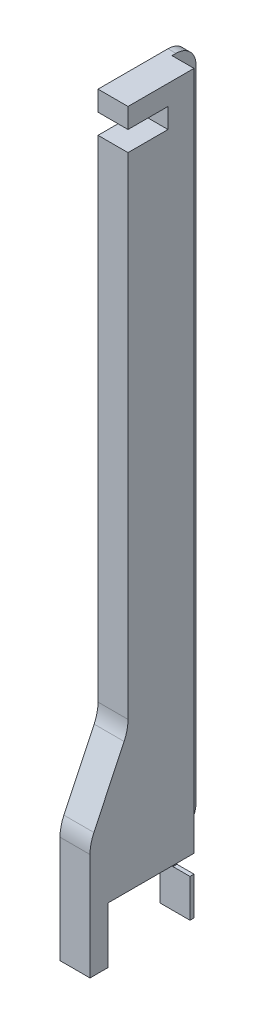
ISO-10303-21;
HEADER;
FILE_DESCRIPTION(('STEP AP214'),'2;1');
FILE_NAME('part.step','',(''),(''),'','','');
FILE_SCHEMA(('AUTOMOTIVE_DESIGN { 1 0 10303 214 1 1 1 1 }'));
ENDSEC;
DATA;
#1=APPLICATION_CONTEXT('core data for automotive mechanical design processes');
#2=APPLICATION_PROTOCOL_DEFINITION('international standard','automotive_design',2000,#1);
#3=PRODUCT_CONTEXT('',#1,'mechanical');
#4=PRODUCT('Part','Part','',(#3));
#5=PRODUCT_RELATED_PRODUCT_CATEGORY('part','',(#4));
#6=PRODUCT_DEFINITION_FORMATION('','',#4);
#7=PRODUCT_DEFINITION_CONTEXT('part definition',#1,'design');
#8=PRODUCT_DEFINITION('design','',#6,#7);
#9=PRODUCT_DEFINITION_SHAPE('','',#8);
#10=(LENGTH_UNIT() NAMED_UNIT(*) SI_UNIT(.MILLI.,.METRE.));
#11=(NAMED_UNIT(*) PLANE_ANGLE_UNIT() SI_UNIT($,.RADIAN.));
#12=(NAMED_UNIT(*) SI_UNIT($,.STERADIAN.) SOLID_ANGLE_UNIT());
#13=UNCERTAINTY_MEASURE_WITH_UNIT(LENGTH_MEASURE(1.E-05),#10,'distance_accuracy_value','');
#14=(GEOMETRIC_REPRESENTATION_CONTEXT(3) GLOBAL_UNCERTAINTY_ASSIGNED_CONTEXT((#13)) GLOBAL_UNIT_ASSIGNED_CONTEXT((#10,
#11,#12)) REPRESENTATION_CONTEXT('',''));
#15=CARTESIAN_POINT('',(0.,0.,0.));
#16=DIRECTION('',(0.,0.,1.));
#17=DIRECTION('',(1.,0.,0.));
#18=AXIS2_PLACEMENT_3D('',#15,#16,#17);
#19=CARTESIAN_POINT('',(183.,0.,26.));
#20=DIRECTION('',(1.,0.,0.));
#21=DIRECTION('',(0.,1.,0.));
#22=AXIS2_PLACEMENT_3D('',#19,#20,#21);
#23=PLANE('',#22);
#24=DIRECTION('',(0.,0.,-1.));
#25=VECTOR('',#24,1.);
#26=CARTESIAN_POINT('',(183.,-340.,26.));
#27=LINE('',#26,#25);
#28=CARTESIAN_POINT('',(183.,-340.,36.));
#29=VERTEX_POINT('',#28);
#30=CARTESIAN_POINT('',(183.,-340.,-7.));
#31=VERTEX_POINT('',#30);
#32=EDGE_CURVE('E333',#29,#31,#27,.T.);
#33=ORIENTED_EDGE('',*,*,#32,.T.);
#34=DIRECTION('',(0.,-1.,0.));
#35=VECTOR('',#34,1.);
#36=CARTESIAN_POINT('',(183.,0.,-7.));
#37=LINE('',#36,#35);
#38=CARTESIAN_POINT('',(183.,0.,-7.));
#39=VERTEX_POINT('',#38);
#40=EDGE_CURVE('E300',#39,#31,#37,.T.);
#41=ORIENTED_EDGE('',*,*,#40,.F.);
#42=DIRECTION('',(0.,0.,-1.));
#43=VECTOR('',#42,1.);
#44=CARTESIAN_POINT('',(183.,0.,26.));
#45=LINE('',#44,#43);
#46=CARTESIAN_POINT('',(183.,0.,26.));
#47=VERTEX_POINT('',#46);
#48=EDGE_CURVE('E329',#47,#39,#45,.T.);
#49=ORIENTED_EDGE('',*,*,#48,.F.);
#50=DIRECTION('',(0.,-1.,0.));
#51=VECTOR('',#50,1.);
#52=CARTESIAN_POINT('',(183.,0.,26.));
#53=LINE('',#52,#51);
#54=CARTESIAN_POINT('',(183.,-9.99999999999994,26.));
#55=VERTEX_POINT('',#54);
#56=EDGE_CURVE('E322',#47,#55,#53,.T.);
#57=ORIENTED_EDGE('',*,*,#56,.T.);
#58=DIRECTION('',(0.,0.,-1.));
#59=VECTOR('',#58,1.);
#60=CARTESIAN_POINT('',(183.,-9.99999999999993,0.));
#61=LINE('',#60,#59);
#62=CARTESIAN_POINT('',(183.,-9.99999999999994,6.00000000000002));
#63=VERTEX_POINT('',#62);
#64=EDGE_CURVE('E222',#55,#63,#61,.T.);
#65=ORIENTED_EDGE('',*,*,#64,.T.);
#66=DIRECTION('',(0.,-1.,0.));
#67=VECTOR('',#66,1.);
#68=CARTESIAN_POINT('',(183.,0.,6.00000000000002));
#69=LINE('',#68,#67);
#70=CARTESIAN_POINT('',(183.,-19.9999999999999,6.00000000000002));
#71=VERTEX_POINT('',#70);
#72=EDGE_CURVE('E230',#63,#71,#69,.T.);
#73=ORIENTED_EDGE('',*,*,#72,.T.);
#74=DIRECTION('',(0.,0.,1.));
#75=VECTOR('',#74,1.);
#76=CARTESIAN_POINT('',(183.,-19.9999999999999,0.));
#77=LINE('',#76,#75);
#78=CARTESIAN_POINT('',(183.,-20.,26.));
#79=VERTEX_POINT('',#78);
#80=EDGE_CURVE('E228',#71,#79,#77,.T.);
#81=ORIENTED_EDGE('',*,*,#80,.T.);
#82=CARTESIAN_POINT('',(183.,-265.491389841085,26.));
#83=VERTEX_POINT('',#82);
#84=EDGE_CURVE('E321',#79,#83,#53,.T.);
#85=ORIENTED_EDGE('',*,*,#84,.T.);
#86=CARTESIAN_POINT('',(183.,-265.491389841085,46.));
#87=DIRECTION('',(1.,0.,0.));
#88=DIRECTION('',(0.,1.,0.));
#89=AXIS2_PLACEMENT_3D('',#86,#87,#88);
#90=CIRCLE('',#89,20.);
#91=CARTESIAN_POINT('',(183.,-274.072526132451,27.9344499129142));
#92=VERTEX_POINT('',#91);
#93=EDGE_CURVE('E366',#83,#92,#90,.F.);
#94=ORIENTED_EDGE('',*,*,#93,.T.);
#95=DIRECTION('',(0.,0.90327750435429,-0.429056814568288));
#96=VECTOR('',#95,1.);
#97=CARTESIAN_POINT('',(183.,-39.6277409484958,-83.4268230494646));
#98=LINE('',#97,#96);
#99=CARTESIAN_POINT('',(183.,-305.927473867549,43.0655500870858));
#100=VERTEX_POINT('',#99);
#101=EDGE_CURVE('E247',#100,#92,#98,.T.);
#102=ORIENTED_EDGE('',*,*,#101,.F.);
#103=CARTESIAN_POINT('',(183.,-314.508610158915,25.));
#104=DIRECTION('',(1.,0.,0.));
#105=DIRECTION('',(0.,1.,0.));
#106=AXIS2_PLACEMENT_3D('',#103,#104,#105);
#107=CIRCLE('',#106,20.);
#108=CARTESIAN_POINT('',(183.,-314.508610158915,45.));
#109=VERTEX_POINT('',#108);
#110=EDGE_CURVE('E360',#100,#109,#107,.T.);
#111=ORIENTED_EDGE('',*,*,#110,.T.);
#112=DIRECTION('',(0.,-1.,0.));
#113=VECTOR('',#112,1.);
#114=CARTESIAN_POINT('',(183.,-310.,45.));
#115=LINE('',#114,#113);
#116=CARTESIAN_POINT('',(183.,-368.,45.));
#117=VERTEX_POINT('',#116);
#118=EDGE_CURVE('E271',#109,#117,#115,.T.);
#119=ORIENTED_EDGE('',*,*,#118,.T.);
#120=DIRECTION('',(0.,0.,-1.));
#121=VECTOR('',#120,1.);
#122=CARTESIAN_POINT('',(183.,-368.,0.));
#123=LINE('',#122,#121);
#124=CARTESIAN_POINT('',(183.,-368.,36.));
#125=VERTEX_POINT('',#124);
#126=EDGE_CURVE('E262',#117,#125,#123,.T.);
#127=ORIENTED_EDGE('',*,*,#126,.T.);
#128=DIRECTION('',(0.,1.,0.));
#129=VECTOR('',#128,1.);
#130=CARTESIAN_POINT('',(183.,-368.,36.));
#131=LINE('',#130,#129);
#132=EDGE_CURVE('E265',#125,#29,#131,.T.);
#133=ORIENTED_EDGE('',*,*,#132,.T.);
#134=EDGE_LOOP('',(#33,#41,#49,#57,#65,#73,#81,#85,#94,#102,#111,#119,#127,#133));
#135=FACE_BOUND('',#134,.T.);
#136=ADVANCED_FACE('F34',(#135),#23,.T.);
#137=CARTESIAN_POINT('',(0.,0.,26.));
#138=DIRECTION('',(0.,0.,1.));
#139=DIRECTION('',(1.,0.,0.));
#140=AXIS2_PLACEMENT_3D('',#137,#138,#139);
#141=PLANE('',#140);
#142=DIRECTION('',(0.,-1.,0.));
#143=VECTOR('',#142,1.);
#144=CARTESIAN_POINT('',(168.,-19.9999999999999,26.));
#145=LINE('',#144,#143);
#146=CARTESIAN_POINT('',(168.,0.,26.));
#147=VERTEX_POINT('',#146);
#148=CARTESIAN_POINT('',(168.,-9.99999999999994,26.));
#149=VERTEX_POINT('',#148);
#150=EDGE_CURVE('E326',#147,#149,#145,.T.);
#151=ORIENTED_EDGE('',*,*,#150,.T.);
#152=DIRECTION('',(1.,0.,0.));
#153=VECTOR('',#152,1.);
#154=CARTESIAN_POINT('',(-434.,-10.,26.));
#155=LINE('',#154,#153);
#156=EDGE_CURVE('E233',#149,#55,#155,.T.);
#157=ORIENTED_EDGE('',*,*,#156,.T.);
#158=ORIENTED_EDGE('',*,*,#56,.F.);
#159=DIRECTION('',(-1.,0.,0.));
#160=VECTOR('',#159,1.);
#161=CARTESIAN_POINT('',(-168.,0.,26.));
#162=LINE('',#161,#160);
#163=EDGE_CURVE('E317',#47,#147,#162,.T.);
#164=ORIENTED_EDGE('',*,*,#163,.T.);
#165=EDGE_LOOP('',(#151,#157,#158,#164));
#166=FACE_BOUND('',#165,.T.);
#167=ADVANCED_FACE('F464',(#166),#141,.T.);
#168=ORIENTED_EDGE('',*,*,#84,.F.);
#169=DIRECTION('',(1.,0.,0.));
#170=VECTOR('',#169,1.);
#171=CARTESIAN_POINT('',(-434.,-20.,26.));
#172=LINE('',#171,#170);
#173=CARTESIAN_POINT('',(168.,-19.9999999999999,26.));
#174=VERTEX_POINT('',#173);
#175=EDGE_CURVE('E49',#174,#79,#172,.T.);
#176=ORIENTED_EDGE('',*,*,#175,.F.);
#177=CARTESIAN_POINT('',(168.,-265.491389841085,26.));
#178=VERTEX_POINT('',#177);
#179=EDGE_CURVE('E325',#174,#178,#145,.T.);
#180=ORIENTED_EDGE('',*,*,#179,.T.);
#181=DIRECTION('',(1.,0.,0.));
#182=VECTOR('',#181,1.);
#183=CARTESIAN_POINT('',(0.,-265.491389841085,26.));
#184=LINE('',#183,#182);
#185=EDGE_CURVE('E352',#178,#83,#184,.T.);
#186=ORIENTED_EDGE('',*,*,#185,.T.);
#187=EDGE_LOOP('',(#168,#176,#180,#186));
#188=FACE_BOUND('',#187,.T.);
#189=ADVANCED_FACE('F451',(#188),#141,.T.);
#190=CARTESIAN_POINT('',(168.,-19.9999999999999,26.));
#191=DIRECTION('',(1.,0.,0.));
#192=DIRECTION('',(0.,1.,0.));
#193=AXIS2_PLACEMENT_3D('',#190,#191,#192);
#194=PLANE('',#193);
#195=DIRECTION('',(0.,0.,-1.));
#196=VECTOR('',#195,1.);
#197=CARTESIAN_POINT('',(168.,-9.99999999999994,26.));
#198=LINE('',#197,#196);
#199=CARTESIAN_POINT('',(168.,-9.99999999999994,6.00000000000002));
#200=VERTEX_POINT('',#199);
#201=EDGE_CURVE('E245',#149,#200,#198,.T.);
#202=ORIENTED_EDGE('',*,*,#201,.F.);
#203=ORIENTED_EDGE('',*,*,#150,.F.);
#204=DIRECTION('',(0.,0.,1.));
#205=VECTOR('',#204,1.);
#206=CARTESIAN_POINT('',(168.,0.,-19.));
#207=LINE('',#206,#205);
#208=CARTESIAN_POINT('',(168.,0.,-9.));
#209=VERTEX_POINT('',#208);
#210=EDGE_CURVE('E314',#209,#147,#207,.T.);
#211=ORIENTED_EDGE('',*,*,#210,.F.);
#212=CARTESIAN_POINT('',(168.,-9.99999999999996,-9.));
#213=DIRECTION('',(1.,0.,0.));
#214=DIRECTION('',(0.,1.,0.));
#215=AXIS2_PLACEMENT_3D('',#212,#213,#214);
#216=CIRCLE('',#215,10.);
#217=CARTESIAN_POINT('',(168.,-9.99999999999996,-19.));
#218=VERTEX_POINT('',#217);
#219=EDGE_CURVE('E350',#209,#218,#216,.F.);
#220=ORIENTED_EDGE('',*,*,#219,.T.);
#221=DIRECTION('',(0.,1.,0.));
#222=VECTOR('',#221,1.);
#223=CARTESIAN_POINT('',(168.,0.,-19.));
#224=LINE('',#223,#222);
#225=CARTESIAN_POINT('',(168.,-330.,-19.));
#226=VERTEX_POINT('',#225);
#227=EDGE_CURVE('E307',#226,#218,#224,.T.);
#228=ORIENTED_EDGE('',*,*,#227,.F.);
#229=CARTESIAN_POINT('',(168.,-330.,-9.));
#230=DIRECTION('',(1.,0.,0.));
#231=DIRECTION('',(0.,1.,0.));
#232=AXIS2_PLACEMENT_3D('',#229,#230,#231);
#233=CIRCLE('',#232,10.);
#234=CARTESIAN_POINT('',(168.,-338.,-15.));
#235=VERTEX_POINT('',#234);
#236=EDGE_CURVE('E347',#226,#235,#233,.F.);
#237=ORIENTED_EDGE('',*,*,#236,.T.);
#238=CARTESIAN_POINT('',(168.,-354.,-27.));
#239=DIRECTION('',(1.,0.,0.));
#240=DIRECTION('',(0.,1.,0.));
#241=AXIS2_PLACEMENT_3D('',#238,#239,#240);
#242=CIRCLE('',#241,20.);
#243=CARTESIAN_POINT('',(168.,-354.,-7.));
#244=VERTEX_POINT('',#243);
#245=EDGE_CURVE('E42',#235,#244,#242,.T.);
#246=ORIENTED_EDGE('',*,*,#245,.T.);
#247=DIRECTION('',(0.,1.,0.));
#248=VECTOR('',#247,1.);
#249=CARTESIAN_POINT('',(168.,-368.,-7.));
#250=LINE('',#249,#248);
#251=CARTESIAN_POINT('',(168.,-368.,-7.));
#252=VERTEX_POINT('',#251);
#253=EDGE_CURVE('E291',#252,#244,#250,.T.);
#254=ORIENTED_EDGE('',*,*,#253,.F.);
#255=DIRECTION('',(0.,0.,1.));
#256=VECTOR('',#255,1.);
#257=CARTESIAN_POINT('',(168.,-368.,0.));
#258=LINE('',#257,#256);
#259=CARTESIAN_POINT('',(168.,-368.,-5.));
#260=VERTEX_POINT('',#259);
#261=EDGE_CURVE('E288',#252,#260,#258,.T.);
#262=ORIENTED_EDGE('',*,*,#261,.T.);
#263=DIRECTION('',(0.,1.,0.));
#264=VECTOR('',#263,1.);
#265=CARTESIAN_POINT('',(168.,-368.,-5.));
#266=LINE('',#265,#264);
#267=CARTESIAN_POINT('',(168.,-340.,-5.));
#268=VERTEX_POINT('',#267);
#269=EDGE_CURVE('E295',#260,#268,#266,.T.);
#270=ORIENTED_EDGE('',*,*,#269,.T.);
#271=DIRECTION('',(0.,0.,-1.));
#272=VECTOR('',#271,1.);
#273=CARTESIAN_POINT('',(168.,-340.,26.));
#274=LINE('',#273,#272);
#275=CARTESIAN_POINT('',(168.,-340.,36.));
#276=VERTEX_POINT('',#275);
#277=EDGE_CURVE('E330',#276,#268,#274,.T.);
#278=ORIENTED_EDGE('',*,*,#277,.F.);
#279=DIRECTION('',(0.,1.,0.));
#280=VECTOR('',#279,1.);
#281=CARTESIAN_POINT('',(168.,-368.,36.));
#282=LINE('',#281,#280);
#283=CARTESIAN_POINT('',(168.,-368.,36.));
#284=VERTEX_POINT('',#283);
#285=EDGE_CURVE('E269',#284,#276,#282,.T.);
#286=ORIENTED_EDGE('',*,*,#285,.F.);
#287=DIRECTION('',(0.,0.,1.));
#288=VECTOR('',#287,1.);
#289=CARTESIAN_POINT('',(168.,-368.,0.));
#290=LINE('',#289,#288);
#291=CARTESIAN_POINT('',(168.,-368.,45.));
#292=VERTEX_POINT('',#291);
#293=EDGE_CURVE('E257',#284,#292,#290,.T.);
#294=ORIENTED_EDGE('',*,*,#293,.T.);
#295=DIRECTION('',(0.,-1.,0.));
#296=VECTOR('',#295,1.);
#297=CARTESIAN_POINT('',(168.,-310.,45.));
#298=LINE('',#297,#296);
#299=CARTESIAN_POINT('',(168.,-314.508610158915,45.));
#300=VERTEX_POINT('',#299);
#301=EDGE_CURVE('E272',#300,#292,#298,.T.);
#302=ORIENTED_EDGE('',*,*,#301,.F.);
#303=CARTESIAN_POINT('',(168.,-314.508610158915,25.));
#304=DIRECTION('',(1.,0.,0.));
#305=DIRECTION('',(0.,1.,0.));
#306=AXIS2_PLACEMENT_3D('',#303,#304,#305);
#307=CIRCLE('',#306,20.);
#308=CARTESIAN_POINT('',(168.,-305.927473867549,43.0655500870858));
#309=VERTEX_POINT('',#308);
#310=EDGE_CURVE('E364',#300,#309,#307,.F.);
#311=ORIENTED_EDGE('',*,*,#310,.T.);
#312=DIRECTION('',(0.,0.90327750435429,-0.429056814568288));
#313=VECTOR('',#312,1.);
#314=CARTESIAN_POINT('',(168.,-39.6277409484958,-83.4268230494646));
#315=LINE('',#314,#313);
#316=CARTESIAN_POINT('',(168.,-274.072526132451,27.9344499129142));
#317=VERTEX_POINT('',#316);
#318=EDGE_CURVE('E248',#309,#317,#315,.T.);
#319=ORIENTED_EDGE('',*,*,#318,.T.);
#320=CARTESIAN_POINT('',(168.,-265.491389841085,46.));
#321=DIRECTION('',(1.,0.,0.));
#322=DIRECTION('',(0.,1.,0.));
#323=AXIS2_PLACEMENT_3D('',#320,#321,#322);
#324=CIRCLE('',#323,20.);
#325=EDGE_CURVE('E368',#317,#178,#324,.T.);
#326=ORIENTED_EDGE('',*,*,#325,.T.);
#327=ORIENTED_EDGE('',*,*,#179,.F.);
#328=DIRECTION('',(0.,0.,1.));
#329=VECTOR('',#328,1.);
#330=CARTESIAN_POINT('',(168.,-19.9999999999999,26.));
#331=LINE('',#330,#329);
#332=CARTESIAN_POINT('',(168.,-19.9999999999999,6.00000000000002));
#333=VERTEX_POINT('',#332);
#334=EDGE_CURVE('E236',#333,#174,#331,.T.);
#335=ORIENTED_EDGE('',*,*,#334,.F.);
#336=DIRECTION('',(0.,-1.,0.));
#337=VECTOR('',#336,1.);
#338=CARTESIAN_POINT('',(168.,-19.9999999999999,6.00000000000002));
#339=LINE('',#338,#337);
#340=EDGE_CURVE('E243',#200,#333,#339,.T.);
#341=ORIENTED_EDGE('',*,*,#340,.F.);
#342=EDGE_LOOP('',(#202,#203,#211,#220,#228,#237,#246,#254,#262,#270,#278,#286,#294,#302,#311,
#319,#326,#327,#335,#341));
#343=FACE_BOUND('',#342,.T.);
#344=ADVANCED_FACE('F377',(#343),#194,.F.);
#345=DIRECTION('',(0.,0.,-1.));
#346=VECTOR('',#345,1.);
#347=CARTESIAN_POINT('',(183.,-349.,-7.));
#348=LINE('',#347,#346);
#349=CARTESIAN_POINT('',(183.,-349.,-5.));
#350=VERTEX_POINT('',#349);
#351=CARTESIAN_POINT('',(183.,-349.,-7.));
#352=VERTEX_POINT('',#351);
#353=EDGE_CURVE('E215',#350,#352,#348,.T.);
#354=ORIENTED_EDGE('',*,*,#353,.F.);
#355=DIRECTION('',(0.,1.,0.));
#356=VECTOR('',#355,1.);
#357=CARTESIAN_POINT('',(183.,-368.,-5.));
#358=LINE('',#357,#356);
#359=CARTESIAN_POINT('',(183.,-368.,-5.));
#360=VERTEX_POINT('',#359);
#361=EDGE_CURVE('E220',#360,#350,#358,.T.);
#362=ORIENTED_EDGE('',*,*,#361,.F.);
#363=DIRECTION('',(0.,0.,-1.));
#364=VECTOR('',#363,1.);
#365=CARTESIAN_POINT('',(183.,-368.,0.));
#366=LINE('',#365,#364);
#367=CARTESIAN_POINT('',(183.,-368.,-7.));
#368=VERTEX_POINT('',#367);
#369=EDGE_CURVE('E283',#360,#368,#366,.T.);
#370=ORIENTED_EDGE('',*,*,#369,.T.);
#371=EDGE_CURVE('E299',#352,#368,#37,.T.);
#372=ORIENTED_EDGE('',*,*,#371,.F.);
#373=EDGE_LOOP('',(#354,#362,#370,#372));
#374=FACE_BOUND('',#373,.T.);
#375=ADVANCED_FACE('F417',(#374),#23,.T.);
#376=CARTESIAN_POINT('',(168.,0.,26.));
#377=DIRECTION('',(0.,1.,0.));
#378=DIRECTION('',(-1.,0.,0.));
#379=AXIS2_PLACEMENT_3D('',#376,#377,#378);
#380=PLANE('',#379);
#381=ORIENTED_EDGE('',*,*,#210,.T.);
#382=ORIENTED_EDGE('',*,*,#163,.F.);
#383=ORIENTED_EDGE('',*,*,#48,.T.);
#384=DIRECTION('',(1.,0.,0.));
#385=VECTOR('',#384,1.);
#386=CARTESIAN_POINT('',(0.,0.,-7.));
#387=LINE('',#386,#385);
#388=CARTESIAN_POINT('',(172.,0.,-7.));
#389=VERTEX_POINT('',#388);
#390=EDGE_CURVE('E303',#389,#39,#387,.T.);
#391=ORIENTED_EDGE('',*,*,#390,.F.);
#392=DIRECTION('',(0.,0.,1.));
#393=VECTOR('',#392,1.);
#394=CARTESIAN_POINT('',(172.,0.,-19.));
#395=LINE('',#394,#393);
#396=CARTESIAN_POINT('',(172.,0.,-9.));
#397=VERTEX_POINT('',#396);
#398=EDGE_CURVE('E313',#397,#389,#395,.T.);
#399=ORIENTED_EDGE('',*,*,#398,.F.);
#400=DIRECTION('',(1.,0.,0.));
#401=VECTOR('',#400,1.);
#402=CARTESIAN_POINT('',(168.,0.,-9.));
#403=LINE('',#402,#401);
#404=EDGE_CURVE('E332',#397,#209,#403,.F.);
#405=ORIENTED_EDGE('',*,*,#404,.T.);
#406=EDGE_LOOP('',(#381,#382,#383,#391,#399,#405));
#407=FACE_BOUND('',#406,.T.);
#408=ADVANCED_FACE('F404',(#407),#380,.T.);
#409=CARTESIAN_POINT('',(183.,-340.,26.));
#410=DIRECTION('',(0.,-1.,0.));
#411=DIRECTION('',(0.,0.,-1.));
#412=AXIS2_PLACEMENT_3D('',#409,#410,#411);
#413=PLANE('',#412);
#414=DIRECTION('',(1.,0.,0.));
#415=VECTOR('',#414,1.);
#416=CARTESIAN_POINT('',(0.,-340.,-4.99999999999992));
#417=LINE('',#416,#415);
#418=CARTESIAN_POINT('',(174.5,-340.,-5.));
#419=VERTEX_POINT('',#418);
#420=EDGE_CURVE('E205',#268,#419,#417,.T.);
#421=ORIENTED_EDGE('',*,*,#420,.T.);
#422=DIRECTION('',(0.,0.,-1.));
#423=VECTOR('',#422,1.);
#424=CARTESIAN_POINT('',(174.5,-340.,0.));
#425=LINE('',#424,#423);
#426=CARTESIAN_POINT('',(174.5,-340.,-7.));
#427=VERTEX_POINT('',#426);
#428=EDGE_CURVE('E200',#419,#427,#425,.T.);
#429=ORIENTED_EDGE('',*,*,#428,.T.);
#430=DIRECTION('',(-1.,0.,0.));
#431=VECTOR('',#430,1.);
#432=CARTESIAN_POINT('',(0.,-340.,-7.));
#433=LINE('',#432,#431);
#434=EDGE_CURVE('E276',#31,#427,#433,.T.);
#435=ORIENTED_EDGE('',*,*,#434,.F.);
#436=ORIENTED_EDGE('',*,*,#32,.F.);
#437=DIRECTION('',(1.,0.,0.));
#438=VECTOR('',#437,1.);
#439=CARTESIAN_POINT('',(0.,-340.,36.));
#440=LINE('',#439,#438);
#441=EDGE_CURVE('E251',#276,#29,#440,.T.);
#442=ORIENTED_EDGE('',*,*,#441,.F.);
#443=ORIENTED_EDGE('',*,*,#277,.T.);
#444=EDGE_LOOP('',(#421,#429,#435,#436,#442,#443));
#445=FACE_BOUND('',#444,.T.);
#446=ADVANCED_FACE('F414',(#445),#413,.T.);
#447=CARTESIAN_POINT('',(0.,-368.,-4.99999999999992));
#448=DIRECTION('',(0.,0.,1.));
#449=DIRECTION('',(1.,0.,0.));
#450=AXIS2_PLACEMENT_3D('',#447,#448,#449);
#451=PLANE('',#450);
#452=DIRECTION('',(1.,0.,0.));
#453=VECTOR('',#452,1.);
#454=CARTESIAN_POINT('',(174.5,-349.,-5.));
#455=LINE('',#454,#453);
#456=CARTESIAN_POINT('',(174.5,-349.,-5.));
#457=VERTEX_POINT('',#456);
#458=EDGE_CURVE('E211',#457,#350,#455,.T.);
#459=ORIENTED_EDGE('',*,*,#458,.F.);
#460=DIRECTION('',(0.,1.,0.));
#461=VECTOR('',#460,1.);
#462=CARTESIAN_POINT('',(174.5,-345.,-5.));
#463=LINE('',#462,#461);
#464=EDGE_CURVE('E195',#457,#419,#463,.T.);
#465=ORIENTED_EDGE('',*,*,#464,.T.);
#466=ORIENTED_EDGE('',*,*,#420,.F.);
#467=ORIENTED_EDGE('',*,*,#269,.F.);
#468=DIRECTION('',(1.,0.,0.));
#469=VECTOR('',#468,1.);
#470=CARTESIAN_POINT('',(0.,-368.,-4.99999999999992));
#471=LINE('',#470,#469);
#472=EDGE_CURVE('E286',#260,#360,#471,.T.);
#473=ORIENTED_EDGE('',*,*,#472,.T.);
#474=ORIENTED_EDGE('',*,*,#361,.T.);
#475=EDGE_LOOP('',(#459,#465,#466,#467,#473,#474));
#476=FACE_BOUND('',#475,.T.);
#477=ADVANCED_FACE('F218',(#476),#451,.T.);
#478=CARTESIAN_POINT('',(172.,0.,-19.));
#479=DIRECTION('',(1.,0.,0.));
#480=DIRECTION('',(0.,1.,0.));
#481=AXIS2_PLACEMENT_3D('',#478,#479,#480);
#482=PLANE('',#481);
#483=ORIENTED_EDGE('',*,*,#398,.T.);
#484=DIRECTION('',(0.,1.,0.));
#485=VECTOR('',#484,1.);
#486=CARTESIAN_POINT('',(172.,0.,-7.));
#487=LINE('',#486,#485);
#488=CARTESIAN_POINT('',(172.,-354.,-7.));
#489=VERTEX_POINT('',#488);
#490=EDGE_CURVE('E56',#489,#389,#487,.T.);
#491=ORIENTED_EDGE('',*,*,#490,.F.);
#492=CARTESIAN_POINT('',(172.,-354.,-27.));
#493=DIRECTION('',(1.,0.,0.));
#494=DIRECTION('',(0.,1.,0.));
#495=AXIS2_PLACEMENT_3D('',#492,#493,#494);
#496=CIRCLE('',#495,20.);
#497=CARTESIAN_POINT('',(172.,-338.,-15.));
#498=VERTEX_POINT('',#497);
#499=EDGE_CURVE('E11',#489,#498,#496,.F.);
#500=ORIENTED_EDGE('',*,*,#499,.T.);
#501=CARTESIAN_POINT('',(172.,-330.,-9.));
#502=DIRECTION('',(1.,0.,0.));
#503=DIRECTION('',(0.,1.,0.));
#504=AXIS2_PLACEMENT_3D('',#501,#502,#503);
#505=CIRCLE('',#504,10.);
#506=CARTESIAN_POINT('',(172.,-330.,-19.));
#507=VERTEX_POINT('',#506);
#508=EDGE_CURVE('E343',#498,#507,#505,.T.);
#509=ORIENTED_EDGE('',*,*,#508,.T.);
#510=DIRECTION('',(0.,1.,0.));
#511=VECTOR('',#510,1.);
#512=CARTESIAN_POINT('',(172.,0.,-19.));
#513=LINE('',#512,#511);
#514=CARTESIAN_POINT('',(172.,-9.99999999999996,-19.));
#515=VERTEX_POINT('',#514);
#516=EDGE_CURVE('E310',#507,#515,#513,.T.);
#517=ORIENTED_EDGE('',*,*,#516,.T.);
#518=CARTESIAN_POINT('',(172.,-9.99999999999996,-9.));
#519=DIRECTION('',(1.,0.,0.));
#520=DIRECTION('',(0.,1.,0.));
#521=AXIS2_PLACEMENT_3D('',#518,#519,#520);
#522=CIRCLE('',#521,10.);
#523=EDGE_CURVE('E345',#515,#397,#522,.T.);
#524=ORIENTED_EDGE('',*,*,#523,.T.);
#525=EDGE_LOOP('',(#483,#491,#500,#509,#517,#524));
#526=FACE_BOUND('',#525,.T.);
#527=ADVANCED_FACE('F388',(#526),#482,.T.);
#528=CARTESIAN_POINT('',(0.,0.,-19.));
#529=DIRECTION('',(0.,0.,1.));
#530=DIRECTION('',(1.,0.,0.));
#531=AXIS2_PLACEMENT_3D('',#528,#529,#530);
#532=PLANE('',#531);
#533=ORIENTED_EDGE('',*,*,#227,.T.);
#534=DIRECTION('',(1.,0.,0.));
#535=VECTOR('',#534,1.);
#536=CARTESIAN_POINT('',(172.,-9.99999999999996,-19.));
#537=LINE('',#536,#535);
#538=EDGE_CURVE('E340',#218,#515,#537,.T.);
#539=ORIENTED_EDGE('',*,*,#538,.T.);
#540=ORIENTED_EDGE('',*,*,#516,.F.);
#541=DIRECTION('',(-1.,0.,0.));
#542=VECTOR('',#541,1.);
#543=CARTESIAN_POINT('',(168.,-330.,-19.));
#544=LINE('',#543,#542);
#545=EDGE_CURVE('E337',#507,#226,#544,.T.);
#546=ORIENTED_EDGE('',*,*,#545,.T.);
#547=EDGE_LOOP('',(#533,#539,#540,#546));
#548=FACE_BOUND('',#547,.T.);
#549=ADVANCED_FACE('F394',(#548),#532,.F.);
#550=CARTESIAN_POINT('',(0.,-9.99999999999998,-9.));
#551=DIRECTION('',(-1.,0.,0.));
#552=DIRECTION('',(0.,-1.,0.));
#553=AXIS2_PLACEMENT_3D('',#550,#551,#552);
#554=CYLINDRICAL_SURFACE('',#553,10.);
#555=ORIENTED_EDGE('',*,*,#219,.F.);
#556=ORIENTED_EDGE('',*,*,#404,.F.);
#557=ORIENTED_EDGE('',*,*,#523,.F.);
#558=ORIENTED_EDGE('',*,*,#538,.F.);
#559=EDGE_LOOP('',(#555,#556,#557,#558));
#560=FACE_BOUND('',#559,.T.);
#561=ADVANCED_FACE('F400',(#560),#554,.T.);
#562=CARTESIAN_POINT('',(0.,-330.,-9.));
#563=DIRECTION('',(1.,0.,0.));
#564=DIRECTION('',(0.,0.,-1.));
#565=AXIS2_PLACEMENT_3D('',#562,#563,#564);
#566=CYLINDRICAL_SURFACE('',#565,10.);
#567=ORIENTED_EDGE('',*,*,#508,.F.);
#568=DIRECTION('',(1.,0.,0.));
#569=VECTOR('',#568,1.);
#570=CARTESIAN_POINT('',(0.,-338.,-15.));
#571=LINE('',#570,#569);
#572=EDGE_CURVE('E371',#498,#235,#571,.F.);
#573=ORIENTED_EDGE('',*,*,#572,.T.);
#574=ORIENTED_EDGE('',*,*,#236,.F.);
#575=ORIENTED_EDGE('',*,*,#545,.F.);
#576=EDGE_LOOP('',(#567,#573,#574,#575));
#577=FACE_BOUND('',#576,.T.);
#578=ADVANCED_FACE('F392',(#577),#566,.T.);
#579=CARTESIAN_POINT('',(0.,0.,-7.));
#580=DIRECTION('',(0.,0.,1.));
#581=DIRECTION('',(1.,0.,0.));
#582=AXIS2_PLACEMENT_3D('',#579,#580,#581);
#583=PLANE('',#582);
#584=ORIENTED_EDGE('',*,*,#40,.T.);
#585=ORIENTED_EDGE('',*,*,#434,.T.);
#586=DIRECTION('',(0.,1.,0.));
#587=VECTOR('',#586,1.);
#588=CARTESIAN_POINT('',(174.5,-345.,-7.));
#589=LINE('',#588,#587);
#590=CARTESIAN_POINT('',(174.5,-349.,-7.));
#591=VERTEX_POINT('',#590);
#592=EDGE_CURVE('E206',#591,#427,#589,.T.);
#593=ORIENTED_EDGE('',*,*,#592,.F.);
#594=DIRECTION('',(1.,0.,0.));
#595=VECTOR('',#594,1.);
#596=CARTESIAN_POINT('',(174.5,-349.,-7.));
#597=LINE('',#596,#595);
#598=EDGE_CURVE('E214',#591,#352,#597,.T.);
#599=ORIENTED_EDGE('',*,*,#598,.T.);
#600=ORIENTED_EDGE('',*,*,#371,.T.);
#601=DIRECTION('',(-1.,0.,0.));
#602=VECTOR('',#601,1.);
#603=CARTESIAN_POINT('',(0.,-368.,-7.));
#604=LINE('',#603,#602);
#605=EDGE_CURVE('E280',#368,#252,#604,.T.);
#606=ORIENTED_EDGE('',*,*,#605,.T.);
#607=ORIENTED_EDGE('',*,*,#253,.T.);
#608=DIRECTION('',(1.,0.,0.));
#609=VECTOR('',#608,1.);
#610=CARTESIAN_POINT('',(0.,-354.,-7.));
#611=LINE('',#610,#609);
#612=EDGE_CURVE('E374',#244,#489,#611,.T.);
#613=ORIENTED_EDGE('',*,*,#612,.T.);
#614=ORIENTED_EDGE('',*,*,#490,.T.);
#615=ORIENTED_EDGE('',*,*,#390,.T.);
#616=EDGE_LOOP('',(#584,#585,#593,#599,#600,#606,#607,#613,#614,#615));
#617=FACE_BOUND('',#616,.T.);
#618=ADVANCED_FACE('F383',(#617),#583,.F.);
#619=CARTESIAN_POINT('',(0.,-368.,0.));
#620=DIRECTION('',(0.,-1.,0.));
#621=DIRECTION('',(0.,0.,-1.));
#622=AXIS2_PLACEMENT_3D('',#619,#620,#621);
#623=PLANE('',#622);
#624=ORIENTED_EDGE('',*,*,#605,.F.);
#625=ORIENTED_EDGE('',*,*,#369,.F.);
#626=ORIENTED_EDGE('',*,*,#472,.F.);
#627=ORIENTED_EDGE('',*,*,#261,.F.);
#628=EDGE_LOOP('',(#624,#625,#626,#627));
#629=FACE_BOUND('',#628,.T.);
#630=ADVANCED_FACE('F421',(#629),#623,.T.);
#631=CARTESIAN_POINT('',(174.5,-345.,0.));
#632=DIRECTION('',(1.,0.,0.));
#633=DIRECTION('',(0.,0.,-1.));
#634=AXIS2_PLACEMENT_3D('',#631,#632,#633);
#635=PLANE('',#634);
#636=ORIENTED_EDGE('',*,*,#428,.F.);
#637=ORIENTED_EDGE('',*,*,#464,.F.);
#638=DIRECTION('',(0.,0.,-1.));
#639=VECTOR('',#638,1.);
#640=CARTESIAN_POINT('',(174.5,-349.,-7.));
#641=LINE('',#640,#639);
#642=EDGE_CURVE('E199',#457,#591,#641,.T.);
#643=ORIENTED_EDGE('',*,*,#642,.T.);
#644=ORIENTED_EDGE('',*,*,#592,.T.);
#645=EDGE_LOOP('',(#636,#637,#643,#644));
#646=FACE_BOUND('',#645,.T.);
#647=ADVANCED_FACE('F197',(#646),#635,.T.);
#648=CARTESIAN_POINT('',(0.,-310.,45.));
#649=DIRECTION('',(0.,0.,-1.));
#650=DIRECTION('',(-1.,0.,0.));
#651=AXIS2_PLACEMENT_3D('',#648,#649,#650);
#652=PLANE('',#651);
#653=ORIENTED_EDGE('',*,*,#118,.F.);
#654=DIRECTION('',(1.,0.,0.));
#655=VECTOR('',#654,1.);
#656=CARTESIAN_POINT('',(0.,-314.508610158915,45.));
#657=LINE('',#656,#655);
#658=EDGE_CURVE('E362',#109,#300,#657,.F.);
#659=ORIENTED_EDGE('',*,*,#658,.T.);
#660=ORIENTED_EDGE('',*,*,#301,.T.);
#661=DIRECTION('',(1.,0.,0.));
#662=VECTOR('',#661,1.);
#663=CARTESIAN_POINT('',(0.,-368.,45.));
#664=LINE('',#663,#662);
#665=EDGE_CURVE('E254',#292,#117,#664,.T.);
#666=ORIENTED_EDGE('',*,*,#665,.T.);
#667=EDGE_LOOP('',(#653,#659,#660,#666));
#668=FACE_BOUND('',#667,.T.);
#669=ADVANCED_FACE('F509',(#668),#652,.F.);
#670=CARTESIAN_POINT('',(0.,-368.,36.));
#671=DIRECTION('',(0.,0.,1.));
#672=DIRECTION('',(1.,0.,0.));
#673=AXIS2_PLACEMENT_3D('',#670,#671,#672);
#674=PLANE('',#673);
#675=ORIENTED_EDGE('',*,*,#441,.T.);
#676=ORIENTED_EDGE('',*,*,#132,.F.);
#677=DIRECTION('',(1.,0.,0.));
#678=VECTOR('',#677,1.);
#679=CARTESIAN_POINT('',(0.,-368.,36.));
#680=LINE('',#679,#678);
#681=EDGE_CURVE('E260',#284,#125,#680,.T.);
#682=ORIENTED_EDGE('',*,*,#681,.F.);
#683=ORIENTED_EDGE('',*,*,#285,.T.);
#684=EDGE_LOOP('',(#675,#676,#682,#683));
#685=FACE_BOUND('',#684,.T.);
#686=ADVANCED_FACE('F425',(#685),#674,.F.);
#687=CARTESIAN_POINT('',(0.,-368.,0.));
#688=DIRECTION('',(0.,-1.,0.));
#689=DIRECTION('',(0.,0.,-1.));
#690=AXIS2_PLACEMENT_3D('',#687,#688,#689);
#691=PLANE('',#690);
#692=ORIENTED_EDGE('',*,*,#665,.F.);
#693=ORIENTED_EDGE('',*,*,#293,.F.);
#694=ORIENTED_EDGE('',*,*,#681,.T.);
#695=ORIENTED_EDGE('',*,*,#126,.F.);
#696=EDGE_LOOP('',(#692,#693,#694,#695));
#697=FACE_BOUND('',#696,.T.);
#698=ADVANCED_FACE('F430',(#697),#691,.T.);
#699=CARTESIAN_POINT('',(168.,-39.6277409484958,-83.4268230494646));
#700=DIRECTION('',(0.,-0.429056814568288,-0.90327750435429));
#701=DIRECTION('',(0.,0.90327750435429,-0.429056814568288));
#702=AXIS2_PLACEMENT_3D('',#699,#700,#701);
#703=PLANE('',#702);
#704=ORIENTED_EDGE('',*,*,#101,.T.);
#705=DIRECTION('',(1.,0.,0.));
#706=VECTOR('',#705,1.);
#707=CARTESIAN_POINT('',(168.,-274.072526132451,27.9344499129142));
#708=LINE('',#707,#706);
#709=EDGE_CURVE('E358',#92,#317,#708,.F.);
#710=ORIENTED_EDGE('',*,*,#709,.T.);
#711=ORIENTED_EDGE('',*,*,#318,.F.);
#712=DIRECTION('',(1.,0.,0.));
#713=VECTOR('',#712,1.);
#714=CARTESIAN_POINT('',(168.,-305.927473867549,43.0655500870858));
#715=LINE('',#714,#713);
#716=EDGE_CURVE('E355',#309,#100,#715,.T.);
#717=ORIENTED_EDGE('',*,*,#716,.T.);
#718=EDGE_LOOP('',(#704,#710,#711,#717));
#719=FACE_BOUND('',#718,.T.);
#720=ADVANCED_FACE('F441',(#719),#703,.F.);
#721=CARTESIAN_POINT('',(0.,-265.491389841085,46.));
#722=DIRECTION('',(1.,0.,0.));
#723=DIRECTION('',(0.,1.,0.));
#724=AXIS2_PLACEMENT_3D('',#721,#722,#723);
#725=CYLINDRICAL_SURFACE('',#724,20.);
#726=ORIENTED_EDGE('',*,*,#325,.F.);
#727=ORIENTED_EDGE('',*,*,#709,.F.);
#728=ORIENTED_EDGE('',*,*,#93,.F.);
#729=ORIENTED_EDGE('',*,*,#185,.F.);
#730=EDGE_LOOP('',(#726,#727,#728,#729));
#731=FACE_BOUND('',#730,.T.);
#732=ADVANCED_FACE('F449',(#731),#725,.F.);
#733=CARTESIAN_POINT('',(168.,-314.508610158915,25.));
#734=DIRECTION('',(1.,0.,0.));
#735=DIRECTION('',(0.,1.,0.));
#736=AXIS2_PLACEMENT_3D('',#733,#734,#735);
#737=CYLINDRICAL_SURFACE('',#736,20.);
#738=ORIENTED_EDGE('',*,*,#310,.F.);
#739=ORIENTED_EDGE('',*,*,#658,.F.);
#740=ORIENTED_EDGE('',*,*,#110,.F.);
#741=ORIENTED_EDGE('',*,*,#716,.F.);
#742=EDGE_LOOP('',(#738,#739,#740,#741));
#743=FACE_BOUND('',#742,.T.);
#744=ADVANCED_FACE('F438',(#743),#737,.T.);
#745=CARTESIAN_POINT('',(0.,-354.,-27.));
#746=DIRECTION('',(1.,0.,0.));
#747=DIRECTION('',(0.,0.,-1.));
#748=AXIS2_PLACEMENT_3D('',#745,#746,#747);
#749=CYLINDRICAL_SURFACE('',#748,20.);
#750=ORIENTED_EDGE('',*,*,#499,.F.);
#751=ORIENTED_EDGE('',*,*,#612,.F.);
#752=ORIENTED_EDGE('',*,*,#245,.F.);
#753=ORIENTED_EDGE('',*,*,#572,.F.);
#754=EDGE_LOOP('',(#750,#751,#752,#753));
#755=FACE_BOUND('',#754,.T.);
#756=ADVANCED_FACE('F36',(#755),#749,.F.);
#757=CARTESIAN_POINT('',(-434.,-10.,0.));
#758=DIRECTION('',(0.,-1.,0.));
#759=DIRECTION('',(0.,0.,-1.));
#760=AXIS2_PLACEMENT_3D('',#757,#758,#759);
#761=PLANE('',#760);
#762=ORIENTED_EDGE('',*,*,#201,.T.);
#763=DIRECTION('',(1.,0.,0.));
#764=VECTOR('',#763,1.);
#765=CARTESIAN_POINT('',(-434.,-10.,6.00000000000002));
#766=LINE('',#765,#764);
#767=EDGE_CURVE('E234',#200,#63,#766,.T.);
#768=ORIENTED_EDGE('',*,*,#767,.T.);
#769=ORIENTED_EDGE('',*,*,#64,.F.);
#770=ORIENTED_EDGE('',*,*,#156,.F.);
#771=EDGE_LOOP('',(#762,#768,#769,#770));
#772=FACE_BOUND('',#771,.T.);
#773=ADVANCED_FACE('F462',(#772),#761,.T.);
#774=CARTESIAN_POINT('',(-434.,0.,6.00000000000002));
#775=DIRECTION('',(0.,0.,1.));
#776=DIRECTION('',(1.,0.,0.));
#777=AXIS2_PLACEMENT_3D('',#774,#775,#776);
#778=PLANE('',#777);
#779=ORIENTED_EDGE('',*,*,#340,.T.);
#780=DIRECTION('',(1.,0.,0.));
#781=VECTOR('',#780,1.);
#782=CARTESIAN_POINT('',(-434.,-20.,6.00000000000002));
#783=LINE('',#782,#781);
#784=EDGE_CURVE('E237',#333,#71,#783,.T.);
#785=ORIENTED_EDGE('',*,*,#784,.T.);
#786=ORIENTED_EDGE('',*,*,#72,.F.);
#787=ORIENTED_EDGE('',*,*,#767,.F.);
#788=EDGE_LOOP('',(#779,#785,#786,#787));
#789=FACE_BOUND('',#788,.T.);
#790=ADVANCED_FACE('F459',(#789),#778,.T.);
#791=CARTESIAN_POINT('',(-434.,-20.,0.));
#792=DIRECTION('',(0.,1.,0.));
#793=DIRECTION('',(0.,0.,1.));
#794=AXIS2_PLACEMENT_3D('',#791,#792,#793);
#795=PLANE('',#794);
#796=ORIENTED_EDGE('',*,*,#334,.T.);
#797=ORIENTED_EDGE('',*,*,#175,.T.);
#798=ORIENTED_EDGE('',*,*,#80,.F.);
#799=ORIENTED_EDGE('',*,*,#784,.F.);
#800=EDGE_LOOP('',(#796,#797,#798,#799));
#801=FACE_BOUND('',#800,.T.);
#802=ADVANCED_FACE('F456',(#801),#795,.T.);
#803=CARTESIAN_POINT('',(174.5,-349.,-7.));
#804=DIRECTION('',(0.,-1.,0.));
#805=DIRECTION('',(1.,0.,0.));
#806=AXIS2_PLACEMENT_3D('',#803,#804,#805);
#807=PLANE('',#806);
#808=ORIENTED_EDGE('',*,*,#353,.T.);
#809=ORIENTED_EDGE('',*,*,#598,.F.);
#810=ORIENTED_EDGE('',*,*,#642,.F.);
#811=ORIENTED_EDGE('',*,*,#458,.T.);
#812=EDGE_LOOP('',(#808,#809,#810,#811));
#813=FACE_BOUND('',#812,.T.);
#814=ADVANCED_FACE('F210',(#813),#807,.F.);
#815=CLOSED_SHELL('',(#136,#167,#189,#344,#375,#408,#446,#477,#527,#549,#561,#578,#618,#630,
#647,#669,#686,#698,#720,#732,#744,#756,#773,#790,#802,#814));
#816=MANIFOLD_SOLID_BREP('B2',#815);
#817=ADVANCED_BREP_SHAPE_REPRESENTATION('',(#18,#816),#14);
#818=SHAPE_DEFINITION_REPRESENTATION(#9,#817);
ENDSEC;
END-ISO-10303-21;
